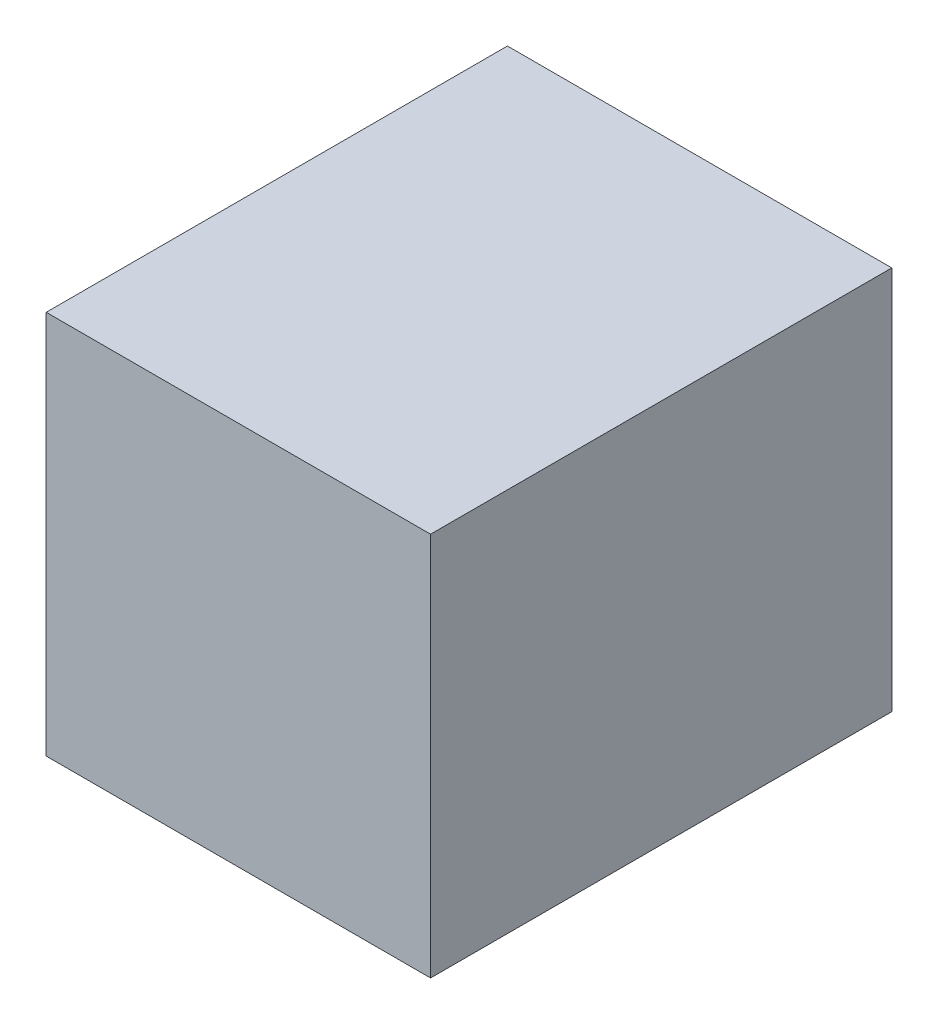
ISO-10303-21;
HEADER;
FILE_DESCRIPTION(('STEP AP214'),'2;1');
FILE_NAME('part.step','',(''),(''),'','','');
FILE_SCHEMA(('AUTOMOTIVE_DESIGN { 1 0 10303 214 1 1 1 1 }'));
ENDSEC;
DATA;
#1=APPLICATION_CONTEXT('core data for automotive mechanical design processes');
#2=APPLICATION_PROTOCOL_DEFINITION('international standard','automotive_design',2000,#1);
#3=PRODUCT_CONTEXT('',#1,'mechanical');
#4=PRODUCT('Part','Part','',(#3));
#5=PRODUCT_RELATED_PRODUCT_CATEGORY('part','',(#4));
#6=PRODUCT_DEFINITION_FORMATION('','',#4);
#7=PRODUCT_DEFINITION_CONTEXT('part definition',#1,'design');
#8=PRODUCT_DEFINITION('design','',#6,#7);
#9=PRODUCT_DEFINITION_SHAPE('','',#8);
#10=(LENGTH_UNIT() NAMED_UNIT(*) SI_UNIT(.MILLI.,.METRE.));
#11=(NAMED_UNIT(*) PLANE_ANGLE_UNIT() SI_UNIT($,.RADIAN.));
#12=(NAMED_UNIT(*) SI_UNIT($,.STERADIAN.) SOLID_ANGLE_UNIT());
#13=UNCERTAINTY_MEASURE_WITH_UNIT(LENGTH_MEASURE(1.E-05),#10,'distance_accuracy_value','');
#14=(GEOMETRIC_REPRESENTATION_CONTEXT(3) GLOBAL_UNCERTAINTY_ASSIGNED_CONTEXT((#13)) GLOBAL_UNIT_ASSIGNED_CONTEXT((#10,
#11,#12)) REPRESENTATION_CONTEXT('',''));
#15=CARTESIAN_POINT('',(0.,0.,0.));
#16=DIRECTION('',(0.,0.,1.));
#17=DIRECTION('',(1.,0.,0.));
#18=AXIS2_PLACEMENT_3D('',#15,#16,#17);
#19=CARTESIAN_POINT('',(-62.5,-62.5,0.));
#20=DIRECTION('',(-1.,0.,0.));
#21=DIRECTION('',(0.,0.,1.));
#22=AXIS2_PLACEMENT_3D('',#19,#20,#21);
#23=PLANE('',#22);
#24=DIRECTION('',(0.,1.,0.));
#25=VECTOR('',#24,1.);
#26=CARTESIAN_POINT('',(-62.5,0.,0.));
#27=LINE('',#26,#25);
#28=CARTESIAN_POINT('',(-62.5,62.5,0.));
#29=VERTEX_POINT('',#28);
#30=CARTESIAN_POINT('',(-62.5,-62.5,0.));
#31=VERTEX_POINT('',#30);
#32=EDGE_CURVE('E54',#29,#31,#27,.F.);
#33=ORIENTED_EDGE('',*,*,#32,.T.);
#34=DIRECTION('',(0.,0.,-1.));
#35=VECTOR('',#34,1.);
#36=CARTESIAN_POINT('',(-62.5,-62.5,0.));
#37=LINE('',#36,#35);
#38=CARTESIAN_POINT('',(-62.5,-62.5,150.));
#39=VERTEX_POINT('',#38);
#40=EDGE_CURVE('E66',#39,#31,#37,.T.);
#41=ORIENTED_EDGE('',*,*,#40,.F.);
#42=DIRECTION('',(0.,1.,0.));
#43=VECTOR('',#42,1.);
#44=CARTESIAN_POINT('',(-62.5,0.,150.));
#45=LINE('',#44,#43);
#46=CARTESIAN_POINT('',(-62.5,62.5,150.));
#47=VERTEX_POINT('',#46);
#48=EDGE_CURVE('E19',#47,#39,#45,.F.);
#49=ORIENTED_EDGE('',*,*,#48,.F.);
#50=DIRECTION('',(0.,0.,1.));
#51=VECTOR('',#50,1.);
#52=CARTESIAN_POINT('',(-62.5,62.5,0.));
#53=LINE('',#52,#51);
#54=EDGE_CURVE('E80',#29,#47,#53,.T.);
#55=ORIENTED_EDGE('',*,*,#54,.F.);
#56=EDGE_LOOP('',(#33,#41,#49,#55));
#57=FACE_BOUND('',#56,.T.);
#58=ADVANCED_FACE('F16',(#57),#23,.T.);
#59=CARTESIAN_POINT('',(0.,0.,150.));
#60=DIRECTION('',(0.,0.,1.));
#61=DIRECTION('',(1.,0.,0.));
#62=AXIS2_PLACEMENT_3D('',#59,#60,#61);
#63=PLANE('',#62);
#64=ORIENTED_EDGE('',*,*,#48,.T.);
#65=DIRECTION('',(1.,0.,0.));
#66=VECTOR('',#65,1.);
#67=CARTESIAN_POINT('',(62.5,-62.5,150.));
#68=LINE('',#67,#66);
#69=CARTESIAN_POINT('',(62.5,-62.5,150.));
#70=VERTEX_POINT('',#69);
#71=EDGE_CURVE('E61',#70,#39,#68,.F.);
#72=ORIENTED_EDGE('',*,*,#71,.F.);
#73=DIRECTION('',(0.,1.,0.));
#74=VECTOR('',#73,1.);
#75=CARTESIAN_POINT('',(62.5,62.5,150.));
#76=LINE('',#75,#74);
#77=CARTESIAN_POINT('',(62.5,62.5,150.));
#78=VERTEX_POINT('',#77);
#79=EDGE_CURVE('E82',#78,#70,#76,.F.);
#80=ORIENTED_EDGE('',*,*,#79,.F.);
#81=DIRECTION('',(1.,0.,0.));
#82=VECTOR('',#81,1.);
#83=CARTESIAN_POINT('',(-62.5,62.5,150.));
#84=LINE('',#83,#82);
#85=EDGE_CURVE('E64',#47,#78,#84,.T.);
#86=ORIENTED_EDGE('',*,*,#85,.F.);
#87=EDGE_LOOP('',(#64,#72,#80,#86));
#88=FACE_BOUND('',#87,.T.);
#89=ADVANCED_FACE('F59',(#88),#63,.T.);
#90=CARTESIAN_POINT('',(62.5,-62.5,0.));
#91=DIRECTION('',(0.,-1.,0.));
#92=DIRECTION('',(0.,0.,-1.));
#93=AXIS2_PLACEMENT_3D('',#90,#91,#92);
#94=PLANE('',#93);
#95=DIRECTION('',(1.,0.,0.));
#96=VECTOR('',#95,1.);
#97=CARTESIAN_POINT('',(0.,-62.5,0.));
#98=LINE('',#97,#96);
#99=CARTESIAN_POINT('',(62.5,-62.5,0.));
#100=VERTEX_POINT('',#99);
#101=EDGE_CURVE('E76',#31,#100,#98,.T.);
#102=ORIENTED_EDGE('',*,*,#101,.T.);
#103=DIRECTION('',(0.,0.,-1.));
#104=VECTOR('',#103,1.);
#105=CARTESIAN_POINT('',(62.5,-62.5,0.));
#106=LINE('',#105,#104);
#107=EDGE_CURVE('E72',#70,#100,#106,.T.);
#108=ORIENTED_EDGE('',*,*,#107,.F.);
#109=ORIENTED_EDGE('',*,*,#71,.T.);
#110=ORIENTED_EDGE('',*,*,#40,.T.);
#111=EDGE_LOOP('',(#102,#108,#109,#110));
#112=FACE_BOUND('',#111,.T.);
#113=ADVANCED_FACE('F70',(#112),#94,.T.);
#114=CARTESIAN_POINT('',(0.,0.,0.));
#115=DIRECTION('',(0.,0.,1.));
#116=DIRECTION('',(1.,0.,0.));
#117=AXIS2_PLACEMENT_3D('',#114,#115,#116);
#118=PLANE('',#117);
#119=DIRECTION('',(0.,1.,0.));
#120=VECTOR('',#119,1.);
#121=CARTESIAN_POINT('',(62.5,62.5,0.));
#122=LINE('',#121,#120);
#123=CARTESIAN_POINT('',(62.5,62.5,0.));
#124=VERTEX_POINT('',#123);
#125=EDGE_CURVE('E25',#100,#124,#122,.T.);
#126=ORIENTED_EDGE('',*,*,#125,.F.);
#127=ORIENTED_EDGE('',*,*,#101,.F.);
#128=ORIENTED_EDGE('',*,*,#32,.F.);
#129=DIRECTION('',(1.,0.,0.));
#130=VECTOR('',#129,1.);
#131=CARTESIAN_POINT('',(-62.5,62.5,0.));
#132=LINE('',#131,#130);
#133=EDGE_CURVE('E34',#124,#29,#132,.F.);
#134=ORIENTED_EDGE('',*,*,#133,.F.);
#135=EDGE_LOOP('',(#126,#127,#128,#134));
#136=FACE_BOUND('',#135,.T.);
#137=ADVANCED_FACE('F88',(#136),#118,.F.);
#138=CARTESIAN_POINT('',(-62.5,62.5,0.));
#139=DIRECTION('',(0.,1.,0.));
#140=DIRECTION('',(0.,0.,1.));
#141=AXIS2_PLACEMENT_3D('',#138,#139,#140);
#142=PLANE('',#141);
#143=ORIENTED_EDGE('',*,*,#133,.T.);
#144=ORIENTED_EDGE('',*,*,#54,.T.);
#145=ORIENTED_EDGE('',*,*,#85,.T.);
#146=DIRECTION('',(0.,0.,-1.));
#147=VECTOR('',#146,1.);
#148=CARTESIAN_POINT('',(62.5,62.5,0.));
#149=LINE('',#148,#147);
#150=EDGE_CURVE('E10',#124,#78,#149,.F.);
#151=ORIENTED_EDGE('',*,*,#150,.F.);
#152=EDGE_LOOP('',(#143,#144,#145,#151));
#153=FACE_BOUND('',#152,.T.);
#154=ADVANCED_FACE('F90',(#153),#142,.T.);
#155=CARTESIAN_POINT('',(62.5,62.5,0.));
#156=DIRECTION('',(1.,0.,0.));
#157=DIRECTION('',(0.,0.,-1.));
#158=AXIS2_PLACEMENT_3D('',#155,#156,#157);
#159=PLANE('',#158);
#160=ORIENTED_EDGE('',*,*,#125,.T.);
#161=ORIENTED_EDGE('',*,*,#150,.T.);
#162=ORIENTED_EDGE('',*,*,#79,.T.);
#163=ORIENTED_EDGE('',*,*,#107,.T.);
#164=EDGE_LOOP('',(#160,#161,#162,#163));
#165=FACE_BOUND('',#164,.T.);
#166=ADVANCED_FACE('F87',(#165),#159,.T.);
#167=CLOSED_SHELL('',(#58,#89,#113,#137,#154,#166));
#168=MANIFOLD_SOLID_BREP('B1',#167);
#169=ADVANCED_BREP_SHAPE_REPRESENTATION('',(#18,#168),#14);
#170=SHAPE_DEFINITION_REPRESENTATION(#9,#169);
ENDSEC;
END-ISO-10303-21;
